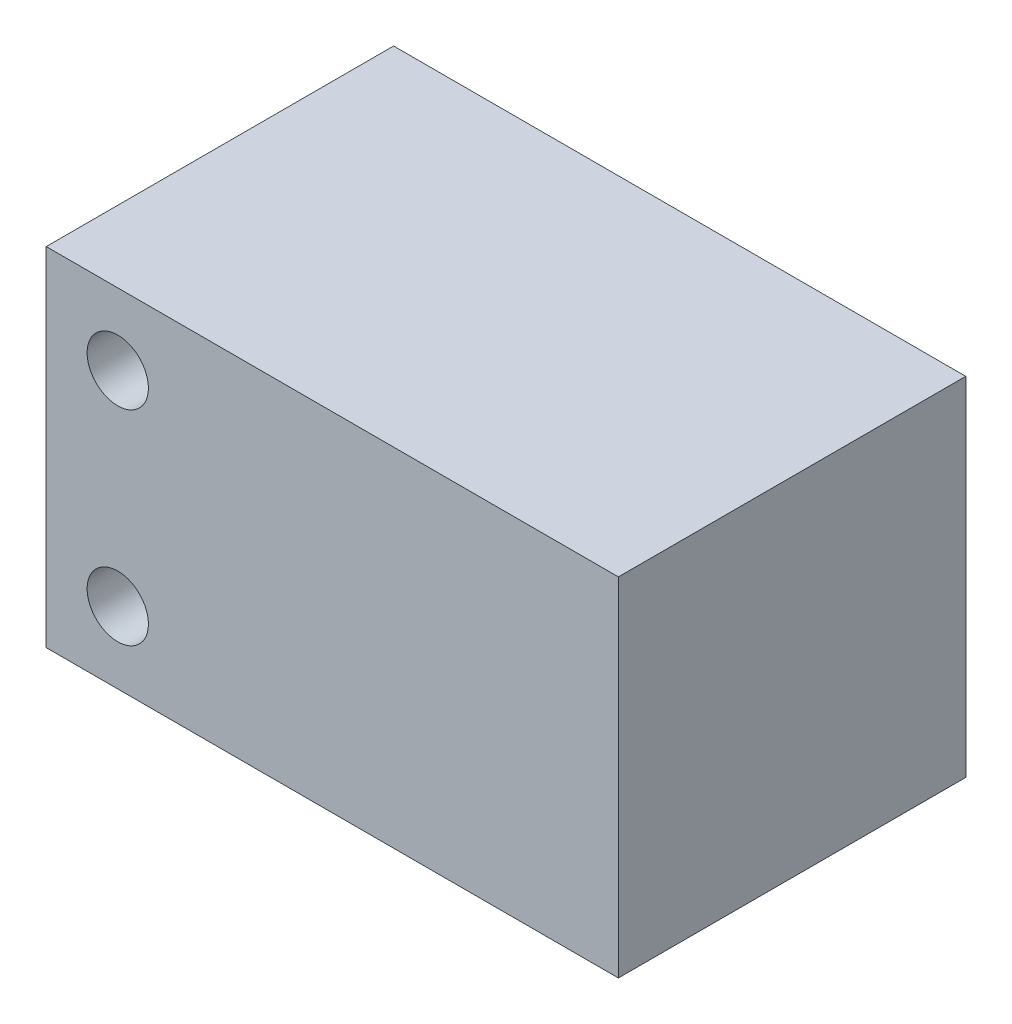
ISO-10303-21;
HEADER;
FILE_DESCRIPTION(('STEP AP214'),'2;1');
FILE_NAME('part.step','',(''),(''),'','','');
FILE_SCHEMA(('AUTOMOTIVE_DESIGN { 1 0 10303 214 1 1 1 1 }'));
ENDSEC;
DATA;
#1=APPLICATION_CONTEXT('core data for automotive mechanical design processes');
#2=APPLICATION_PROTOCOL_DEFINITION('international standard','automotive_design',2000,#1);
#3=PRODUCT_CONTEXT('',#1,'mechanical');
#4=PRODUCT('Part','Part','',(#3));
#5=PRODUCT_RELATED_PRODUCT_CATEGORY('part','',(#4));
#6=PRODUCT_DEFINITION_FORMATION('','',#4);
#7=PRODUCT_DEFINITION_CONTEXT('part definition',#1,'design');
#8=PRODUCT_DEFINITION('design','',#6,#7);
#9=PRODUCT_DEFINITION_SHAPE('','',#8);
#10=(LENGTH_UNIT() NAMED_UNIT(*) SI_UNIT(.MILLI.,.METRE.));
#11=(NAMED_UNIT(*) PLANE_ANGLE_UNIT() SI_UNIT($,.RADIAN.));
#12=(NAMED_UNIT(*) SI_UNIT($,.STERADIAN.) SOLID_ANGLE_UNIT());
#13=UNCERTAINTY_MEASURE_WITH_UNIT(LENGTH_MEASURE(1.E-05),#10,'distance_accuracy_value','');
#14=(GEOMETRIC_REPRESENTATION_CONTEXT(3) GLOBAL_UNCERTAINTY_ASSIGNED_CONTEXT((#13)) GLOBAL_UNIT_ASSIGNED_CONTEXT((#10,
#11,#12)) REPRESENTATION_CONTEXT('',''));
#15=CARTESIAN_POINT('',(0.,0.,0.));
#16=DIRECTION('',(0.,0.,1.));
#17=DIRECTION('',(1.,0.,0.));
#18=AXIS2_PLACEMENT_3D('',#15,#16,#17);
#19=CARTESIAN_POINT('',(0.,0.,17.));
#20=DIRECTION('',(1.,0.,0.));
#21=DIRECTION('',(0.,0.,-1.));
#22=AXIS2_PLACEMENT_3D('',#19,#20,#21);
#23=PLANE('',#22);
#24=DIRECTION('',(0.,-1.,0.));
#25=VECTOR('',#24,1.);
#26=CARTESIAN_POINT('',(0.,0.,0.));
#27=LINE('',#26,#25);
#28=CARTESIAN_POINT('',(0.,17.,0.));
#29=VERTEX_POINT('',#28);
#30=CARTESIAN_POINT('',(0.,0.,0.));
#31=VERTEX_POINT('',#30);
#32=EDGE_CURVE('E99',#29,#31,#27,.T.);
#33=ORIENTED_EDGE('',*,*,#32,.T.);
#34=DIRECTION('',(0.,0.,-1.));
#35=VECTOR('',#34,1.);
#36=CARTESIAN_POINT('',(0.,0.,17.));
#37=LINE('',#36,#35);
#38=CARTESIAN_POINT('',(0.,0.,17.));
#39=VERTEX_POINT('',#38);
#40=EDGE_CURVE('E11',#39,#31,#37,.T.);
#41=ORIENTED_EDGE('',*,*,#40,.F.);
#42=DIRECTION('',(0.,-1.,0.));
#43=VECTOR('',#42,1.);
#44=CARTESIAN_POINT('',(0.,0.,17.));
#45=LINE('',#44,#43);
#46=CARTESIAN_POINT('',(0.,17.,17.));
#47=VERTEX_POINT('',#46);
#48=EDGE_CURVE('E87',#47,#39,#45,.T.);
#49=ORIENTED_EDGE('',*,*,#48,.F.);
#50=DIRECTION('',(0.,0.,-1.));
#51=VECTOR('',#50,1.);
#52=CARTESIAN_POINT('',(0.,17.,17.));
#53=LINE('',#52,#51);
#54=EDGE_CURVE('E95',#47,#29,#53,.T.);
#55=ORIENTED_EDGE('',*,*,#54,.T.);
#56=EDGE_LOOP('',(#33,#41,#49,#55));
#57=FACE_BOUND('',#56,.T.);
#58=ADVANCED_FACE('F36',(#57),#23,.F.);
#59=CARTESIAN_POINT('',(0.,0.,17.));
#60=DIRECTION('',(0.,1.,0.));
#61=DIRECTION('',(0.,0.,1.));
#62=AXIS2_PLACEMENT_3D('',#59,#60,#61);
#63=PLANE('',#62);
#64=DIRECTION('',(1.,0.,0.));
#65=VECTOR('',#64,1.);
#66=CARTESIAN_POINT('',(0.,0.,0.));
#67=LINE('',#66,#65);
#68=CARTESIAN_POINT('',(28.,0.,0.));
#69=VERTEX_POINT('',#68);
#70=EDGE_CURVE('E91',#31,#69,#67,.T.);
#71=ORIENTED_EDGE('',*,*,#70,.T.);
#72=DIRECTION('',(0.,0.,-1.));
#73=VECTOR('',#72,1.);
#74=CARTESIAN_POINT('',(28.,0.,17.));
#75=LINE('',#74,#73);
#76=CARTESIAN_POINT('',(28.,0.,17.));
#77=VERTEX_POINT('',#76);
#78=EDGE_CURVE('E44',#77,#69,#75,.T.);
#79=ORIENTED_EDGE('',*,*,#78,.F.);
#80=DIRECTION('',(1.,0.,0.));
#81=VECTOR('',#80,1.);
#82=CARTESIAN_POINT('',(0.,0.,17.));
#83=LINE('',#82,#81);
#84=EDGE_CURVE('E82',#39,#77,#83,.T.);
#85=ORIENTED_EDGE('',*,*,#84,.F.);
#86=ORIENTED_EDGE('',*,*,#40,.T.);
#87=EDGE_LOOP('',(#71,#79,#85,#86));
#88=FACE_BOUND('',#87,.T.);
#89=ADVANCED_FACE('F90',(#88),#63,.F.);
#90=CARTESIAN_POINT('',(28.,0.,17.));
#91=DIRECTION('',(-1.,0.,0.));
#92=DIRECTION('',(0.,0.,1.));
#93=AXIS2_PLACEMENT_3D('',#90,#91,#92);
#94=PLANE('',#93);
#95=DIRECTION('',(0.,1.,0.));
#96=VECTOR('',#95,1.);
#97=CARTESIAN_POINT('',(28.,0.,0.));
#98=LINE('',#97,#96);
#99=CARTESIAN_POINT('',(28.,17.,0.));
#100=VERTEX_POINT('',#99);
#101=EDGE_CURVE('E69',#69,#100,#98,.T.);
#102=ORIENTED_EDGE('',*,*,#101,.T.);
#103=DIRECTION('',(0.,0.,-1.));
#104=VECTOR('',#103,1.);
#105=CARTESIAN_POINT('',(28.,17.,17.));
#106=LINE('',#105,#104);
#107=CARTESIAN_POINT('',(28.,17.,17.));
#108=VERTEX_POINT('',#107);
#109=EDGE_CURVE('E92',#108,#100,#106,.T.);
#110=ORIENTED_EDGE('',*,*,#109,.F.);
#111=DIRECTION('',(0.,1.,0.));
#112=VECTOR('',#111,1.);
#113=CARTESIAN_POINT('',(28.,0.,17.));
#114=LINE('',#113,#112);
#115=EDGE_CURVE('E85',#77,#108,#114,.T.);
#116=ORIENTED_EDGE('',*,*,#115,.F.);
#117=ORIENTED_EDGE('',*,*,#78,.T.);
#118=EDGE_LOOP('',(#102,#110,#116,#117));
#119=FACE_BOUND('',#118,.T.);
#120=ADVANCED_FACE('F93',(#119),#94,.F.);
#121=CARTESIAN_POINT('',(0.,17.,17.));
#122=DIRECTION('',(0.,-1.,0.));
#123=DIRECTION('',(0.,0.,-1.));
#124=AXIS2_PLACEMENT_3D('',#121,#122,#123);
#125=PLANE('',#124);
#126=DIRECTION('',(-1.,0.,0.));
#127=VECTOR('',#126,1.);
#128=CARTESIAN_POINT('',(0.,17.,0.));
#129=LINE('',#128,#127);
#130=EDGE_CURVE('E75',#100,#29,#129,.T.);
#131=ORIENTED_EDGE('',*,*,#130,.T.);
#132=ORIENTED_EDGE('',*,*,#54,.F.);
#133=DIRECTION('',(-1.,0.,0.));
#134=VECTOR('',#133,1.);
#135=CARTESIAN_POINT('',(0.,17.,17.));
#136=LINE('',#135,#134);
#137=EDGE_CURVE('E52',#108,#47,#136,.T.);
#138=ORIENTED_EDGE('',*,*,#137,.F.);
#139=ORIENTED_EDGE('',*,*,#109,.T.);
#140=EDGE_LOOP('',(#131,#132,#138,#139));
#141=FACE_BOUND('',#140,.T.);
#142=ADVANCED_FACE('F107',(#141),#125,.F.);
#143=CARTESIAN_POINT('',(0.,0.,17.));
#144=DIRECTION('',(0.,0.,-1.));
#145=DIRECTION('',(-1.,0.,0.));
#146=AXIS2_PLACEMENT_3D('',#143,#144,#145);
#147=PLANE('',#146);
#148=CARTESIAN_POINT('',(3.5,3.5,17.));
#149=DIRECTION('',(0.,0.,1.));
#150=DIRECTION('',(1.,0.,0.));
#151=AXIS2_PLACEMENT_3D('',#148,#149,#150);
#152=CIRCLE('',#151,1.5);
#153=CARTESIAN_POINT('',(5.,3.5,17.));
#154=VERTEX_POINT('',#153);
#155=EDGE_CURVE('E119',#154,#154,#152,.T.);
#156=ORIENTED_EDGE('',*,*,#155,.F.);
#157=EDGE_LOOP('',(#156));
#158=FACE_BOUND('',#157,.T.);
#159=CARTESIAN_POINT('',(3.5,13.5,17.));
#160=DIRECTION('',(0.,0.,1.));
#161=DIRECTION('',(1.,0.,0.));
#162=AXIS2_PLACEMENT_3D('',#159,#160,#161);
#163=CIRCLE('',#162,1.5);
#164=CARTESIAN_POINT('',(5.,13.5,17.));
#165=VERTEX_POINT('',#164);
#166=EDGE_CURVE('E113',#165,#165,#163,.T.);
#167=ORIENTED_EDGE('',*,*,#166,.F.);
#168=EDGE_LOOP('',(#167));
#169=FACE_BOUND('',#168,.T.);
#170=ORIENTED_EDGE('',*,*,#48,.T.);
#171=ORIENTED_EDGE('',*,*,#84,.T.);
#172=ORIENTED_EDGE('',*,*,#115,.T.);
#173=ORIENTED_EDGE('',*,*,#137,.T.);
#174=EDGE_LOOP('',(#170,#171,#172,#173));
#175=FACE_BOUND('',#174,.T.);
#176=ADVANCED_FACE('F83',(#158,#169,#175),#147,.F.);
#177=CARTESIAN_POINT('',(0.,0.,0.));
#178=DIRECTION('',(0.,0.,-1.));
#179=DIRECTION('',(-1.,0.,0.));
#180=AXIS2_PLACEMENT_3D('',#177,#178,#179);
#181=PLANE('',#180);
#182=CARTESIAN_POINT('',(3.5,3.5,0.));
#183=DIRECTION('',(0.,0.,1.));
#184=DIRECTION('',(1.,0.,0.));
#185=AXIS2_PLACEMENT_3D('',#182,#183,#184);
#186=CIRCLE('',#185,1.5);
#187=CARTESIAN_POINT('',(5.,3.5,0.));
#188=VERTEX_POINT('',#187);
#189=EDGE_CURVE('E116',#188,#188,#186,.T.);
#190=ORIENTED_EDGE('',*,*,#189,.T.);
#191=EDGE_LOOP('',(#190));
#192=FACE_BOUND('',#191,.T.);
#193=CARTESIAN_POINT('',(3.5,13.5,0.));
#194=DIRECTION('',(0.,0.,1.));
#195=DIRECTION('',(1.,0.,0.));
#196=AXIS2_PLACEMENT_3D('',#193,#194,#195);
#197=CIRCLE('',#196,1.5);
#198=CARTESIAN_POINT('',(5.,13.5,0.));
#199=VERTEX_POINT('',#198);
#200=EDGE_CURVE('E102',#199,#199,#197,.T.);
#201=ORIENTED_EDGE('',*,*,#200,.T.);
#202=EDGE_LOOP('',(#201));
#203=FACE_BOUND('',#202,.T.);
#204=ORIENTED_EDGE('',*,*,#32,.F.);
#205=ORIENTED_EDGE('',*,*,#130,.F.);
#206=ORIENTED_EDGE('',*,*,#101,.F.);
#207=ORIENTED_EDGE('',*,*,#70,.F.);
#208=EDGE_LOOP('',(#204,#205,#206,#207));
#209=FACE_BOUND('',#208,.T.);
#210=ADVANCED_FACE('F110',(#192,#203,#209),#181,.T.);
#211=CARTESIAN_POINT('',(3.5,13.5,0.));
#212=DIRECTION('',(0.,0.,1.));
#213=DIRECTION('',(1.,0.,0.));
#214=AXIS2_PLACEMENT_3D('',#211,#212,#213);
#215=CYLINDRICAL_SURFACE('',#214,1.5);
#216=ORIENTED_EDGE('',*,*,#200,.F.);
#217=EDGE_LOOP('',(#216));
#218=FACE_BOUND('',#217,.T.);
#219=ORIENTED_EDGE('',*,*,#166,.T.);
#220=EDGE_LOOP('',(#219));
#221=FACE_BOUND('',#220,.T.);
#222=ADVANCED_FACE('F130',(#218,#221),#215,.F.);
#223=CARTESIAN_POINT('',(3.5,3.5,0.));
#224=DIRECTION('',(0.,0.,1.));
#225=DIRECTION('',(1.,0.,0.));
#226=AXIS2_PLACEMENT_3D('',#223,#224,#225);
#227=CYLINDRICAL_SURFACE('',#226,1.5);
#228=ORIENTED_EDGE('',*,*,#189,.F.);
#229=EDGE_LOOP('',(#228));
#230=FACE_BOUND('',#229,.T.);
#231=ORIENTED_EDGE('',*,*,#155,.T.);
#232=EDGE_LOOP('',(#231));
#233=FACE_BOUND('',#232,.T.);
#234=ADVANCED_FACE('F127',(#230,#233),#227,.F.);
#235=CLOSED_SHELL('',(#58,#89,#120,#142,#176,#210,#222,#234));
#236=MANIFOLD_SOLID_BREP('B2',#235);
#237=ADVANCED_BREP_SHAPE_REPRESENTATION('',(#18,#236),#14);
#238=SHAPE_DEFINITION_REPRESENTATION(#9,#237);
ENDSEC;
END-ISO-10303-21;
